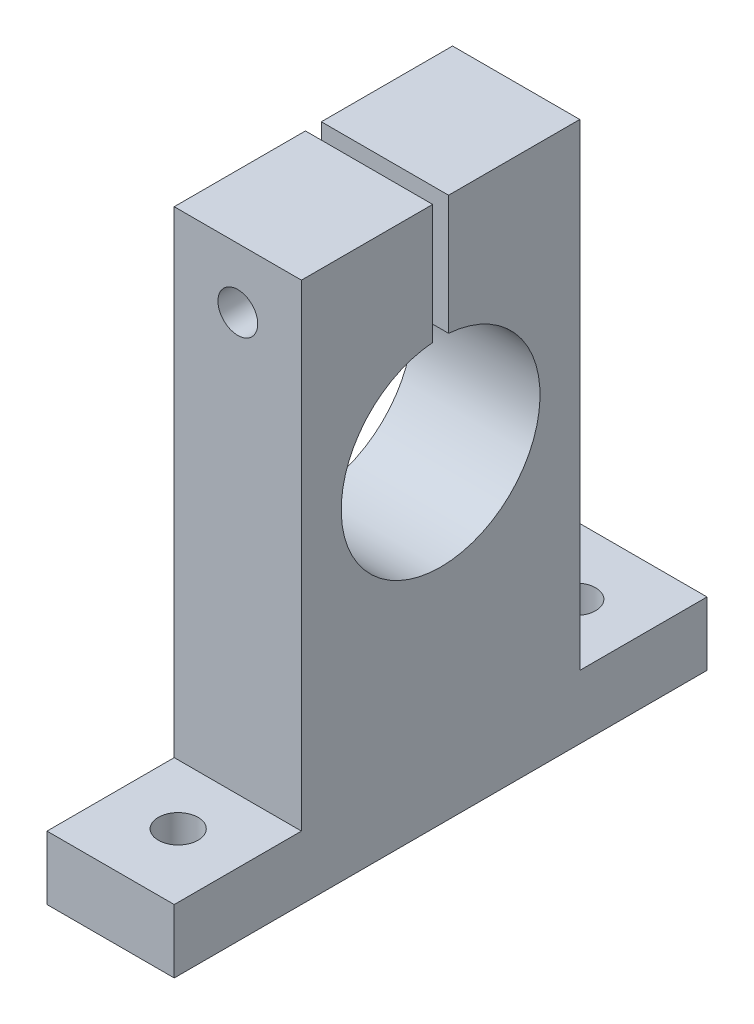
ISO-10303-21;
HEADER;
FILE_DESCRIPTION(('STEP AP214'),'2;1');
FILE_NAME('part.step','',(''),(''),'','','');
FILE_SCHEMA(('AUTOMOTIVE_DESIGN { 1 0 10303 214 1 1 1 1 }'));
ENDSEC;
DATA;
#1=APPLICATION_CONTEXT('core data for automotive mechanical design processes');
#2=APPLICATION_PROTOCOL_DEFINITION('international standard','automotive_design',2000,#1);
#3=PRODUCT_CONTEXT('',#1,'mechanical');
#4=PRODUCT('Part','Part','',(#3));
#5=PRODUCT_RELATED_PRODUCT_CATEGORY('part','',(#4));
#6=PRODUCT_DEFINITION_FORMATION('','',#4);
#7=PRODUCT_DEFINITION_CONTEXT('part definition',#1,'design');
#8=PRODUCT_DEFINITION('design','',#6,#7);
#9=PRODUCT_DEFINITION_SHAPE('','',#8);
#10=(LENGTH_UNIT() NAMED_UNIT(*) SI_UNIT(.MILLI.,.METRE.));
#11=(NAMED_UNIT(*) PLANE_ANGLE_UNIT() SI_UNIT($,.RADIAN.));
#12=(NAMED_UNIT(*) SI_UNIT($,.STERADIAN.) SOLID_ANGLE_UNIT());
#13=UNCERTAINTY_MEASURE_WITH_UNIT(LENGTH_MEASURE(1.E-05),#10,'distance_accuracy_value','');
#14=(GEOMETRIC_REPRESENTATION_CONTEXT(3) GLOBAL_UNCERTAINTY_ASSIGNED_CONTEXT((#13)) GLOBAL_UNIT_ASSIGNED_CONTEXT((#10,
#11,#12)) REPRESENTATION_CONTEXT('',''));
#15=CARTESIAN_POINT('',(0.,0.,0.));
#16=DIRECTION('',(0.,0.,1.));
#17=DIRECTION('',(1.,0.,0.));
#18=AXIS2_PLACEMENT_3D('',#15,#16,#17);
#19=CARTESIAN_POINT('',(16.,27.5,17.5));
#20=DIRECTION('',(0.,0.,-1.));
#21=DIRECTION('',(0.,1.,0.));
#22=AXIS2_PLACEMENT_3D('',#19,#20,#21);
#23=PLANE('',#22);
#24=CARTESIAN_POINT('',(8.,19.9799678971886,17.5));
#25=DIRECTION('',(0.,0.,-1.));
#26=DIRECTION('',(0.,1.,0.));
#27=AXIS2_PLACEMENT_3D('',#24,#25,#26);
#28=CIRCLE('',#27,2.5);
#29=CARTESIAN_POINT('',(8.,22.4799678971886,17.5));
#30=VERTEX_POINT('',#29);
#31=EDGE_CURVE('E270',#30,#30,#28,.T.);
#32=ORIENTED_EDGE('',*,*,#31,.T.);
#33=EDGE_LOOP('',(#32));
#34=FACE_BOUND('',#33,.T.);
#35=DIRECTION('',(0.,-1.,0.));
#36=VECTOR('',#35,1.);
#37=CARTESIAN_POINT('',(0.,27.5,17.5));
#38=LINE('',#37,#36);
#39=CARTESIAN_POINT('',(0.,27.5,17.5));
#40=VERTEX_POINT('',#39);
#41=CARTESIAN_POINT('',(0.,-32.5,17.5));
#42=VERTEX_POINT('',#41);
#43=EDGE_CURVE('E159',#40,#42,#38,.T.);
#44=ORIENTED_EDGE('',*,*,#43,.T.);
#45=DIRECTION('',(-1.,0.,0.));
#46=VECTOR('',#45,1.);
#47=CARTESIAN_POINT('',(16.,-32.5,17.5));
#48=LINE('',#47,#46);
#49=CARTESIAN_POINT('',(16.,-32.5,17.5));
#50=VERTEX_POINT('',#49);
#51=EDGE_CURVE('E11',#50,#42,#48,.T.);
#52=ORIENTED_EDGE('',*,*,#51,.F.);
#53=DIRECTION('',(0.,-1.,0.));
#54=VECTOR('',#53,1.);
#55=CARTESIAN_POINT('',(16.,27.5,17.5));
#56=LINE('',#55,#54);
#57=CARTESIAN_POINT('',(16.,27.5,17.5));
#58=VERTEX_POINT('',#57);
#59=EDGE_CURVE('E182',#58,#50,#56,.T.);
#60=ORIENTED_EDGE('',*,*,#59,.F.);
#61=DIRECTION('',(-1.,0.,0.));
#62=VECTOR('',#61,1.);
#63=CARTESIAN_POINT('',(16.,27.5,17.5));
#64=LINE('',#63,#62);
#65=EDGE_CURVE('E155',#58,#40,#64,.T.);
#66=ORIENTED_EDGE('',*,*,#65,.T.);
#67=EDGE_LOOP('',(#44,#52,#60,#66));
#68=FACE_BOUND('',#67,.T.);
#69=ADVANCED_FACE('F38',(#34,#68),#23,.F.);
#70=CARTESIAN_POINT('',(16.,-32.5,33.5));
#71=DIRECTION('',(0.,-1.,0.));
#72=DIRECTION('',(0.,0.,-1.));
#73=AXIS2_PLACEMENT_3D('',#70,#71,#72);
#74=PLANE('',#73);
#75=CARTESIAN_POINT('',(8.,-32.5,25.));
#76=DIRECTION('',(0.,1.,0.));
#77=DIRECTION('',(0.,0.,1.));
#78=AXIS2_PLACEMENT_3D('',#75,#76,#77);
#79=CIRCLE('',#78,2.5);
#80=CARTESIAN_POINT('',(8.,-32.5,27.5));
#81=VERTEX_POINT('',#80);
#82=EDGE_CURVE('E284',#81,#81,#79,.T.);
#83=ORIENTED_EDGE('',*,*,#82,.F.);
#84=EDGE_LOOP('',(#83));
#85=FACE_BOUND('',#84,.T.);
#86=DIRECTION('',(0.,0.,1.));
#87=VECTOR('',#86,1.);
#88=CARTESIAN_POINT('',(0.,-32.5,33.5));
#89=LINE('',#88,#87);
#90=CARTESIAN_POINT('',(0.,-32.5,33.5));
#91=VERTEX_POINT('',#90);
#92=EDGE_CURVE('E162',#42,#91,#89,.T.);
#93=ORIENTED_EDGE('',*,*,#92,.T.);
#94=DIRECTION('',(-1.,0.,0.));
#95=VECTOR('',#94,1.);
#96=CARTESIAN_POINT('',(16.,-32.5,33.5));
#97=LINE('',#96,#95);
#98=CARTESIAN_POINT('',(16.,-32.5,33.5));
#99=VERTEX_POINT('',#98);
#100=EDGE_CURVE('E47',#99,#91,#97,.T.);
#101=ORIENTED_EDGE('',*,*,#100,.F.);
#102=DIRECTION('',(0.,0.,1.));
#103=VECTOR('',#102,1.);
#104=CARTESIAN_POINT('',(16.,-32.5,33.5));
#105=LINE('',#104,#103);
#106=EDGE_CURVE('E110',#50,#99,#105,.T.);
#107=ORIENTED_EDGE('',*,*,#106,.F.);
#108=ORIENTED_EDGE('',*,*,#51,.T.);
#109=EDGE_LOOP('',(#93,#101,#107,#108));
#110=FACE_BOUND('',#109,.T.);
#111=ADVANCED_FACE('F262',(#85,#110),#74,.F.);
#112=CARTESIAN_POINT('',(16.,-32.5,33.5));
#113=DIRECTION('',(0.,0.,-1.));
#114=DIRECTION('',(-1.,0.,0.));
#115=AXIS2_PLACEMENT_3D('',#112,#113,#114);
#116=PLANE('',#115);
#117=DIRECTION('',(0.,-1.,0.));
#118=VECTOR('',#117,1.);
#119=CARTESIAN_POINT('',(0.,-32.5,33.5));
#120=LINE('',#119,#118);
#121=CARTESIAN_POINT('',(0.,-40.5,33.5));
#122=VERTEX_POINT('',#121);
#123=EDGE_CURVE('E165',#91,#122,#120,.T.);
#124=ORIENTED_EDGE('',*,*,#123,.T.);
#125=DIRECTION('',(-1.,0.,0.));
#126=VECTOR('',#125,1.);
#127=CARTESIAN_POINT('',(16.,-40.5,33.5));
#128=LINE('',#127,#126);
#129=CARTESIAN_POINT('',(16.,-40.5,33.5));
#130=VERTEX_POINT('',#129);
#131=EDGE_CURVE('E201',#130,#122,#128,.T.);
#132=ORIENTED_EDGE('',*,*,#131,.F.);
#133=DIRECTION('',(0.,-1.,0.));
#134=VECTOR('',#133,1.);
#135=CARTESIAN_POINT('',(16.,-32.5,33.5));
#136=LINE('',#135,#134);
#137=EDGE_CURVE('E210',#99,#130,#136,.T.);
#138=ORIENTED_EDGE('',*,*,#137,.F.);
#139=ORIENTED_EDGE('',*,*,#100,.T.);
#140=EDGE_LOOP('',(#124,#132,#138,#139));
#141=FACE_BOUND('',#140,.T.);
#142=ADVANCED_FACE('F208',(#141),#116,.F.);
#143=CARTESIAN_POINT('',(16.,-40.5,33.5));
#144=DIRECTION('',(0.,1.,0.));
#145=DIRECTION('',(0.,0.,1.));
#146=AXIS2_PLACEMENT_3D('',#143,#144,#145);
#147=PLANE('',#146);
#148=CARTESIAN_POINT('',(8.,-40.5,25.));
#149=DIRECTION('',(0.,1.,0.));
#150=DIRECTION('',(0.,0.,1.));
#151=AXIS2_PLACEMENT_3D('',#148,#149,#150);
#152=CIRCLE('',#151,2.5);
#153=CARTESIAN_POINT('',(8.,-40.5,27.5));
#154=VERTEX_POINT('',#153);
#155=EDGE_CURVE('E163',#154,#154,#152,.T.);
#156=ORIENTED_EDGE('',*,*,#155,.T.);
#157=EDGE_LOOP('',(#156));
#158=FACE_BOUND('',#157,.T.);
#159=CARTESIAN_POINT('',(8.,-40.5,-25.));
#160=DIRECTION('',(0.,1.,0.));
#161=DIRECTION('',(0.,0.,1.));
#162=AXIS2_PLACEMENT_3D('',#159,#160,#161);
#163=CIRCLE('',#162,2.5);
#164=CARTESIAN_POINT('',(8.,-40.5,-22.5));
#165=VERTEX_POINT('',#164);
#166=EDGE_CURVE('E276',#165,#165,#163,.T.);
#167=ORIENTED_EDGE('',*,*,#166,.T.);
#168=EDGE_LOOP('',(#167));
#169=FACE_BOUND('',#168,.T.);
#170=DIRECTION('',(0.,0.,-1.));
#171=VECTOR('',#170,1.);
#172=CARTESIAN_POINT('',(0.,-40.5,33.5));
#173=LINE('',#172,#171);
#174=CARTESIAN_POINT('',(0.,-40.5,-33.5));
#175=VERTEX_POINT('',#174);
#176=EDGE_CURVE('E167',#122,#175,#173,.T.);
#177=ORIENTED_EDGE('',*,*,#176,.T.);
#178=DIRECTION('',(-1.,0.,0.));
#179=VECTOR('',#178,1.);
#180=CARTESIAN_POINT('',(16.,-40.5,-33.5));
#181=LINE('',#180,#179);
#182=CARTESIAN_POINT('',(16.,-40.5,-33.5));
#183=VERTEX_POINT('',#182);
#184=EDGE_CURVE('E198',#183,#175,#181,.T.);
#185=ORIENTED_EDGE('',*,*,#184,.F.);
#186=DIRECTION('',(0.,0.,-1.));
#187=VECTOR('',#186,1.);
#188=CARTESIAN_POINT('',(16.,-40.5,33.5));
#189=LINE('',#188,#187);
#190=EDGE_CURVE('E228',#130,#183,#189,.T.);
#191=ORIENTED_EDGE('',*,*,#190,.F.);
#192=ORIENTED_EDGE('',*,*,#131,.T.);
#193=EDGE_LOOP('',(#177,#185,#191,#192));
#194=FACE_BOUND('',#193,.T.);
#195=ADVANCED_FACE('F219',(#158,#169,#194),#147,.F.);
#196=CARTESIAN_POINT('',(16.,-32.5,-33.5));
#197=DIRECTION('',(0.,0.,1.));
#198=DIRECTION('',(1.,0.,0.));
#199=AXIS2_PLACEMENT_3D('',#196,#197,#198);
#200=PLANE('',#199);
#201=DIRECTION('',(0.,1.,0.));
#202=VECTOR('',#201,1.);
#203=CARTESIAN_POINT('',(0.,-32.5,-33.5));
#204=LINE('',#203,#202);
#205=CARTESIAN_POINT('',(0.,-32.5,-33.5));
#206=VERTEX_POINT('',#205);
#207=EDGE_CURVE('E169',#175,#206,#204,.T.);
#208=ORIENTED_EDGE('',*,*,#207,.T.);
#209=DIRECTION('',(-1.,0.,0.));
#210=VECTOR('',#209,1.);
#211=CARTESIAN_POINT('',(16.,-32.5,-33.5));
#212=LINE('',#211,#210);
#213=CARTESIAN_POINT('',(16.,-32.5,-33.5));
#214=VERTEX_POINT('',#213);
#215=EDGE_CURVE('E195',#214,#206,#212,.T.);
#216=ORIENTED_EDGE('',*,*,#215,.F.);
#217=DIRECTION('',(0.,1.,0.));
#218=VECTOR('',#217,1.);
#219=CARTESIAN_POINT('',(16.,-32.5,-33.5));
#220=LINE('',#219,#218);
#221=EDGE_CURVE('E225',#183,#214,#220,.T.);
#222=ORIENTED_EDGE('',*,*,#221,.F.);
#223=ORIENTED_EDGE('',*,*,#184,.T.);
#224=EDGE_LOOP('',(#208,#216,#222,#223));
#225=FACE_BOUND('',#224,.T.);
#226=ADVANCED_FACE('F223',(#225),#200,.F.);
#227=CARTESIAN_POINT('',(16.,-32.5,-17.5));
#228=DIRECTION('',(0.,-1.,0.));
#229=DIRECTION('',(0.,0.,-1.));
#230=AXIS2_PLACEMENT_3D('',#227,#228,#229);
#231=PLANE('',#230);
#232=CARTESIAN_POINT('',(8.,-32.5,-25.));
#233=DIRECTION('',(0.,1.,0.));
#234=DIRECTION('',(0.,0.,1.));
#235=AXIS2_PLACEMENT_3D('',#232,#233,#234);
#236=CIRCLE('',#235,2.5);
#237=CARTESIAN_POINT('',(8.,-32.5,-22.5));
#238=VERTEX_POINT('',#237);
#239=EDGE_CURVE('E272',#238,#238,#236,.T.);
#240=ORIENTED_EDGE('',*,*,#239,.F.);
#241=EDGE_LOOP('',(#240));
#242=FACE_BOUND('',#241,.T.);
#243=DIRECTION('',(0.,0.,1.));
#244=VECTOR('',#243,1.);
#245=CARTESIAN_POINT('',(0.,-32.5,-17.5));
#246=LINE('',#245,#244);
#247=CARTESIAN_POINT('',(0.,-32.5,-17.5));
#248=VERTEX_POINT('',#247);
#249=EDGE_CURVE('E171',#206,#248,#246,.T.);
#250=ORIENTED_EDGE('',*,*,#249,.T.);
#251=DIRECTION('',(-1.,0.,0.));
#252=VECTOR('',#251,1.);
#253=CARTESIAN_POINT('',(16.,-32.5,-17.5));
#254=LINE('',#253,#252);
#255=CARTESIAN_POINT('',(16.,-32.5,-17.5));
#256=VERTEX_POINT('',#255);
#257=EDGE_CURVE('E192',#256,#248,#254,.T.);
#258=ORIENTED_EDGE('',*,*,#257,.F.);
#259=DIRECTION('',(0.,0.,1.));
#260=VECTOR('',#259,1.);
#261=CARTESIAN_POINT('',(16.,-32.5,-17.5));
#262=LINE('',#261,#260);
#263=EDGE_CURVE('E227',#214,#256,#262,.T.);
#264=ORIENTED_EDGE('',*,*,#263,.F.);
#265=ORIENTED_EDGE('',*,*,#215,.T.);
#266=EDGE_LOOP('',(#250,#258,#264,#265));
#267=FACE_BOUND('',#266,.T.);
#268=ADVANCED_FACE('F300',(#242,#267),#231,.F.);
#269=CARTESIAN_POINT('',(16.,27.5,-17.5));
#270=DIRECTION('',(0.,0.,1.));
#271=DIRECTION('',(0.,-1.,0.));
#272=AXIS2_PLACEMENT_3D('',#269,#270,#271);
#273=PLANE('',#272);
#274=CARTESIAN_POINT('',(8.,19.9799678971886,-17.5));
#275=DIRECTION('',(0.,0.,-1.));
#276=DIRECTION('',(0.,1.,0.));
#277=AXIS2_PLACEMENT_3D('',#274,#275,#276);
#278=CIRCLE('',#277,2.5);
#279=CARTESIAN_POINT('',(8.,22.4799678971886,-17.5));
#280=VERTEX_POINT('',#279);
#281=EDGE_CURVE('E443',#280,#280,#278,.T.);
#282=ORIENTED_EDGE('',*,*,#281,.F.);
#283=EDGE_LOOP('',(#282));
#284=FACE_BOUND('',#283,.T.);
#285=DIRECTION('',(0.,1.,0.));
#286=VECTOR('',#285,1.);
#287=CARTESIAN_POINT('',(0.,27.5,-17.5));
#288=LINE('',#287,#286);
#289=CARTESIAN_POINT('',(0.,27.5,-17.5));
#290=VERTEX_POINT('',#289);
#291=EDGE_CURVE('E173',#248,#290,#288,.T.);
#292=ORIENTED_EDGE('',*,*,#291,.T.);
#293=DIRECTION('',(-1.,0.,0.));
#294=VECTOR('',#293,1.);
#295=CARTESIAN_POINT('',(16.,27.5,-17.5));
#296=LINE('',#295,#294);
#297=CARTESIAN_POINT('',(16.,27.5,-17.5));
#298=VERTEX_POINT('',#297);
#299=EDGE_CURVE('E189',#298,#290,#296,.T.);
#300=ORIENTED_EDGE('',*,*,#299,.F.);
#301=DIRECTION('',(0.,1.,0.));
#302=VECTOR('',#301,1.);
#303=CARTESIAN_POINT('',(16.,27.5,-17.5));
#304=LINE('',#303,#302);
#305=EDGE_CURVE('E230',#256,#298,#304,.T.);
#306=ORIENTED_EDGE('',*,*,#305,.F.);
#307=ORIENTED_EDGE('',*,*,#257,.T.);
#308=EDGE_LOOP('',(#292,#300,#306,#307));
#309=FACE_BOUND('',#308,.T.);
#310=ADVANCED_FACE('F303',(#284,#309),#273,.F.);
#311=CARTESIAN_POINT('',(16.,27.5,-1.));
#312=DIRECTION('',(0.,-1.,0.));
#313=DIRECTION('',(0.,0.,-1.));
#314=AXIS2_PLACEMENT_3D('',#311,#312,#313);
#315=PLANE('',#314);
#316=DIRECTION('',(0.,0.,1.));
#317=VECTOR('',#316,1.);
#318=CARTESIAN_POINT('',(0.,27.5,-1.));
#319=LINE('',#318,#317);
#320=CARTESIAN_POINT('',(0.,27.5,-1.));
#321=VERTEX_POINT('',#320);
#322=EDGE_CURVE('E175',#290,#321,#319,.T.);
#323=ORIENTED_EDGE('',*,*,#322,.T.);
#324=DIRECTION('',(-1.,0.,0.));
#325=VECTOR('',#324,1.);
#326=CARTESIAN_POINT('',(16.,27.5,-1.));
#327=LINE('',#326,#325);
#328=CARTESIAN_POINT('',(16.,27.5,-1.));
#329=VERTEX_POINT('',#328);
#330=EDGE_CURVE('E186',#329,#321,#327,.T.);
#331=ORIENTED_EDGE('',*,*,#330,.F.);
#332=DIRECTION('',(0.,0.,1.));
#333=VECTOR('',#332,1.);
#334=CARTESIAN_POINT('',(16.,27.5,-1.));
#335=LINE('',#334,#333);
#336=EDGE_CURVE('E236',#298,#329,#335,.T.);
#337=ORIENTED_EDGE('',*,*,#336,.F.);
#338=ORIENTED_EDGE('',*,*,#299,.T.);
#339=EDGE_LOOP('',(#323,#331,#337,#338));
#340=FACE_BOUND('',#339,.T.);
#341=ADVANCED_FACE('F242',(#340),#315,.F.);
#342=CARTESIAN_POINT('',(16.,27.5,-1.));
#343=DIRECTION('',(0.,0.,-1.));
#344=DIRECTION('',(0.,1.,0.));
#345=AXIS2_PLACEMENT_3D('',#342,#343,#344);
#346=PLANE('',#345);
#347=CARTESIAN_POINT('',(8.,19.9799678971886,-1.));
#348=DIRECTION('',(0.,0.,-1.));
#349=DIRECTION('',(0.,1.,0.));
#350=AXIS2_PLACEMENT_3D('',#347,#348,#349);
#351=CIRCLE('',#350,2.5);
#352=CARTESIAN_POINT('',(8.,22.4799678971886,-1.));
#353=VERTEX_POINT('',#352);
#354=EDGE_CURVE('E273',#353,#353,#351,.T.);
#355=ORIENTED_EDGE('',*,*,#354,.T.);
#356=EDGE_LOOP('',(#355));
#357=FACE_BOUND('',#356,.T.);
#358=DIRECTION('',(0.,-1.,0.));
#359=VECTOR('',#358,1.);
#360=CARTESIAN_POINT('',(0.,27.5,-1.));
#361=LINE('',#360,#359);
#362=CARTESIAN_POINT('',(0.,12.4599357943771,-0.999999999999999));
#363=VERTEX_POINT('',#362);
#364=EDGE_CURVE('E177',#321,#363,#361,.T.);
#365=ORIENTED_EDGE('',*,*,#364,.T.);
#366=DIRECTION('',(-1.,0.,0.));
#367=VECTOR('',#366,1.);
#368=CARTESIAN_POINT('',(16.,12.4599357943771,-0.999999999999999));
#369=LINE('',#368,#367);
#370=CARTESIAN_POINT('',(16.,12.4599357943771,-0.999999999999999));
#371=VERTEX_POINT('',#370);
#372=EDGE_CURVE('E150',#371,#363,#369,.T.);
#373=ORIENTED_EDGE('',*,*,#372,.F.);
#374=DIRECTION('',(0.,-1.,0.));
#375=VECTOR('',#374,1.);
#376=CARTESIAN_POINT('',(16.,27.5,-1.));
#377=LINE('',#376,#375);
#378=EDGE_CURVE('E141',#329,#371,#377,.T.);
#379=ORIENTED_EDGE('',*,*,#378,.F.);
#380=ORIENTED_EDGE('',*,*,#330,.T.);
#381=EDGE_LOOP('',(#365,#373,#379,#380));
#382=FACE_BOUND('',#381,.T.);
#383=ADVANCED_FACE('F246',(#357,#382),#346,.F.);
#384=CARTESIAN_POINT('',(16.,0.,0.));
#385=DIRECTION('',(-1.,0.,0.));
#386=DIRECTION('',(0.,0.,1.));
#387=AXIS2_PLACEMENT_3D('',#384,#385,#386);
#388=CYLINDRICAL_SURFACE('',#387,12.5);
#389=CARTESIAN_POINT('',(0.,0.,0.));
#390=DIRECTION('',(-1.,0.,0.));
#391=DIRECTION('',(0.,0.,-1.));
#392=AXIS2_PLACEMENT_3D('',#389,#390,#391);
#393=CIRCLE('',#392,12.5);
#394=CARTESIAN_POINT('',(0.,12.4599357943771,1.));
#395=VERTEX_POINT('',#394);
#396=EDGE_CURVE('E149',#363,#395,#393,.T.);
#397=ORIENTED_EDGE('',*,*,#396,.T.);
#398=DIRECTION('',(-1.,0.,0.));
#399=VECTOR('',#398,1.);
#400=CARTESIAN_POINT('',(16.,12.4599357943771,1.));
#401=LINE('',#400,#399);
#402=CARTESIAN_POINT('',(16.,12.4599357943771,1.));
#403=VERTEX_POINT('',#402);
#404=EDGE_CURVE('E146',#403,#395,#401,.T.);
#405=ORIENTED_EDGE('',*,*,#404,.F.);
#406=CARTESIAN_POINT('',(16.,0.,0.));
#407=DIRECTION('',(-1.,0.,0.));
#408=DIRECTION('',(0.,0.,-1.));
#409=AXIS2_PLACEMENT_3D('',#406,#407,#408);
#410=CIRCLE('',#409,12.5);
#411=EDGE_CURVE('E135',#371,#403,#410,.T.);
#412=ORIENTED_EDGE('',*,*,#411,.F.);
#413=ORIENTED_EDGE('',*,*,#372,.T.);
#414=EDGE_LOOP('',(#397,#405,#412,#413));
#415=FACE_BOUND('',#414,.T.);
#416=ADVANCED_FACE('F147',(#415),#388,.F.);
#417=CARTESIAN_POINT('',(16.,27.5,1.));
#418=DIRECTION('',(0.,0.,1.));
#419=DIRECTION('',(0.,-1.,0.));
#420=AXIS2_PLACEMENT_3D('',#417,#418,#419);
#421=PLANE('',#420);
#422=CARTESIAN_POINT('',(8.,19.9799678971886,1.));
#423=DIRECTION('',(0.,0.,1.));
#424=DIRECTION('',(0.,-1.,0.));
#425=AXIS2_PLACEMENT_3D('',#422,#423,#424);
#426=CIRCLE('',#425,2.5);
#427=CARTESIAN_POINT('',(8.,17.4799678971886,1.));
#428=VERTEX_POINT('',#427);
#429=EDGE_CURVE('E41',#428,#428,#426,.T.);
#430=ORIENTED_EDGE('',*,*,#429,.T.);
#431=EDGE_LOOP('',(#430));
#432=FACE_BOUND('',#431,.T.);
#433=DIRECTION('',(0.,1.,0.));
#434=VECTOR('',#433,1.);
#435=CARTESIAN_POINT('',(0.,27.5,1.));
#436=LINE('',#435,#434);
#437=CARTESIAN_POINT('',(0.,27.5,1.));
#438=VERTEX_POINT('',#437);
#439=EDGE_CURVE('E96',#395,#438,#436,.T.);
#440=ORIENTED_EDGE('',*,*,#439,.T.);
#441=DIRECTION('',(-1.,0.,0.));
#442=VECTOR('',#441,1.);
#443=CARTESIAN_POINT('',(16.,27.5,1.));
#444=LINE('',#443,#442);
#445=CARTESIAN_POINT('',(16.,27.5,1.));
#446=VERTEX_POINT('',#445);
#447=EDGE_CURVE('E151',#446,#438,#444,.T.);
#448=ORIENTED_EDGE('',*,*,#447,.F.);
#449=DIRECTION('',(0.,1.,0.));
#450=VECTOR('',#449,1.);
#451=CARTESIAN_POINT('',(16.,27.5,1.));
#452=LINE('',#451,#450);
#453=EDGE_CURVE('E139',#403,#446,#452,.T.);
#454=ORIENTED_EDGE('',*,*,#453,.F.);
#455=ORIENTED_EDGE('',*,*,#404,.T.);
#456=EDGE_LOOP('',(#440,#448,#454,#455));
#457=FACE_BOUND('',#456,.T.);
#458=ADVANCED_FACE('F153',(#432,#457),#421,.F.);
#459=CARTESIAN_POINT('',(16.,27.5,17.5));
#460=DIRECTION('',(0.,-1.,0.));
#461=DIRECTION('',(0.,0.,-1.));
#462=AXIS2_PLACEMENT_3D('',#459,#460,#461);
#463=PLANE('',#462);
#464=DIRECTION('',(0.,0.,1.));
#465=VECTOR('',#464,1.);
#466=CARTESIAN_POINT('',(0.,27.5,17.5));
#467=LINE('',#466,#465);
#468=EDGE_CURVE('E102',#438,#40,#467,.T.);
#469=ORIENTED_EDGE('',*,*,#468,.T.);
#470=ORIENTED_EDGE('',*,*,#65,.F.);
#471=DIRECTION('',(0.,0.,1.));
#472=VECTOR('',#471,1.);
#473=CARTESIAN_POINT('',(16.,27.5,17.5));
#474=LINE('',#473,#472);
#475=EDGE_CURVE('E55',#446,#58,#474,.T.);
#476=ORIENTED_EDGE('',*,*,#475,.F.);
#477=ORIENTED_EDGE('',*,*,#447,.T.);
#478=EDGE_LOOP('',(#469,#470,#476,#477));
#479=FACE_BOUND('',#478,.T.);
#480=ADVANCED_FACE('F250',(#479),#463,.F.);
#481=CARTESIAN_POINT('',(16.,0.,0.));
#482=DIRECTION('',(1.,0.,0.));
#483=DIRECTION('',(0.,0.,-1.));
#484=AXIS2_PLACEMENT_3D('',#481,#482,#483);
#485=PLANE('',#484);
#486=ORIENTED_EDGE('',*,*,#59,.T.);
#487=ORIENTED_EDGE('',*,*,#106,.T.);
#488=ORIENTED_EDGE('',*,*,#137,.T.);
#489=ORIENTED_EDGE('',*,*,#190,.T.);
#490=ORIENTED_EDGE('',*,*,#221,.T.);
#491=ORIENTED_EDGE('',*,*,#263,.T.);
#492=ORIENTED_EDGE('',*,*,#305,.T.);
#493=ORIENTED_EDGE('',*,*,#336,.T.);
#494=ORIENTED_EDGE('',*,*,#378,.T.);
#495=ORIENTED_EDGE('',*,*,#411,.T.);
#496=ORIENTED_EDGE('',*,*,#453,.T.);
#497=ORIENTED_EDGE('',*,*,#475,.T.);
#498=EDGE_LOOP('',(#486,#487,#488,#489,#490,#491,#492,#493,#494,#495,#496,#497));
#499=FACE_BOUND('',#498,.T.);
#500=ADVANCED_FACE('F137',(#499),#485,.T.);
#501=CARTESIAN_POINT('',(0.,0.,0.));
#502=DIRECTION('',(1.,0.,0.));
#503=DIRECTION('',(0.,0.,-1.));
#504=AXIS2_PLACEMENT_3D('',#501,#502,#503);
#505=PLANE('',#504);
#506=ORIENTED_EDGE('',*,*,#43,.F.);
#507=ORIENTED_EDGE('',*,*,#468,.F.);
#508=ORIENTED_EDGE('',*,*,#439,.F.);
#509=ORIENTED_EDGE('',*,*,#396,.F.);
#510=ORIENTED_EDGE('',*,*,#364,.F.);
#511=ORIENTED_EDGE('',*,*,#322,.F.);
#512=ORIENTED_EDGE('',*,*,#291,.F.);
#513=ORIENTED_EDGE('',*,*,#249,.F.);
#514=ORIENTED_EDGE('',*,*,#207,.F.);
#515=ORIENTED_EDGE('',*,*,#176,.F.);
#516=ORIENTED_EDGE('',*,*,#123,.F.);
#517=ORIENTED_EDGE('',*,*,#92,.F.);
#518=EDGE_LOOP('',(#506,#507,#508,#509,#510,#511,#512,#513,#514,#515,#516,#517));
#519=FACE_BOUND('',#518,.T.);
#520=ADVANCED_FACE('F214',(#519),#505,.F.);
#521=CARTESIAN_POINT('',(8.,-40.5,-25.));
#522=DIRECTION('',(0.,1.,0.));
#523=DIRECTION('',(0.,0.,1.));
#524=AXIS2_PLACEMENT_3D('',#521,#522,#523);
#525=CYLINDRICAL_SURFACE('',#524,2.5);
#526=ORIENTED_EDGE('',*,*,#166,.F.);
#527=EDGE_LOOP('',(#526));
#528=FACE_BOUND('',#527,.T.);
#529=ORIENTED_EDGE('',*,*,#239,.T.);
#530=EDGE_LOOP('',(#529));
#531=FACE_BOUND('',#530,.T.);
#532=ADVANCED_FACE('F293',(#528,#531),#525,.F.);
#533=CARTESIAN_POINT('',(8.,-40.5,25.));
#534=DIRECTION('',(0.,1.,0.));
#535=DIRECTION('',(0.,0.,1.));
#536=AXIS2_PLACEMENT_3D('',#533,#534,#535);
#537=CYLINDRICAL_SURFACE('',#536,2.5);
#538=ORIENTED_EDGE('',*,*,#155,.F.);
#539=EDGE_LOOP('',(#538));
#540=FACE_BOUND('',#539,.T.);
#541=ORIENTED_EDGE('',*,*,#82,.T.);
#542=EDGE_LOOP('',(#541));
#543=FACE_BOUND('',#542,.T.);
#544=ADVANCED_FACE('F296',(#540,#543),#537,.F.);
#545=CARTESIAN_POINT('',(8.,19.9799678971886,33.5));
#546=DIRECTION('',(0.,0.,-1.));
#547=DIRECTION('',(0.,1.,0.));
#548=AXIS2_PLACEMENT_3D('',#545,#546,#547);
#549=CYLINDRICAL_SURFACE('',#548,2.5);
#550=ORIENTED_EDGE('',*,*,#429,.F.);
#551=EDGE_LOOP('',(#550));
#552=FACE_BOUND('',#551,.T.);
#553=ORIENTED_EDGE('',*,*,#31,.F.);
#554=EDGE_LOOP('',(#553));
#555=FACE_BOUND('',#554,.T.);
#556=ADVANCED_FACE('F358',(#552,#555),#549,.F.);
#557=ORIENTED_EDGE('',*,*,#281,.T.);
#558=EDGE_LOOP('',(#557));
#559=FACE_BOUND('',#558,.T.);
#560=ORIENTED_EDGE('',*,*,#354,.F.);
#561=EDGE_LOOP('',(#560));
#562=FACE_BOUND('',#561,.T.);
#563=ADVANCED_FACE('F395',(#559,#562),#549,.F.);
#564=CLOSED_SHELL('',(#69,#111,#142,#195,#226,#268,#310,#341,#383,#416,#458,#480,#500,#520,#532,
#544,#556,#563));
#565=MANIFOLD_SOLID_BREP('B2',#564);
#566=ADVANCED_BREP_SHAPE_REPRESENTATION('',(#18,#565),#14);
#567=SHAPE_DEFINITION_REPRESENTATION(#9,#566);
ENDSEC;
END-ISO-10303-21;
